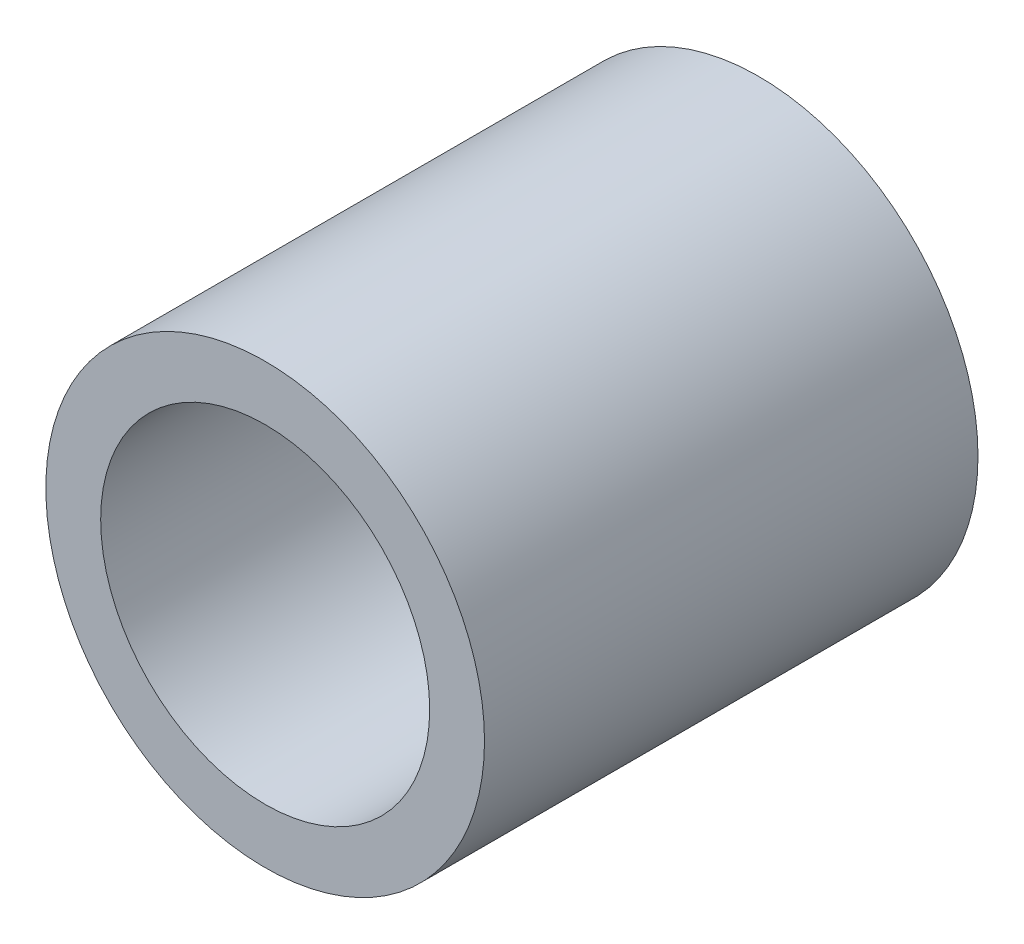
ISO-10303-21;
HEADER;
FILE_DESCRIPTION(('STEP AP214'),'2;1');
FILE_NAME('part.step','',(''),(''),'','','');
FILE_SCHEMA(('AUTOMOTIVE_DESIGN { 1 0 10303 214 1 1 1 1 }'));
ENDSEC;
DATA;
#1=APPLICATION_CONTEXT('core data for automotive mechanical design processes');
#2=APPLICATION_PROTOCOL_DEFINITION('international standard','automotive_design',2000,#1);
#3=PRODUCT_CONTEXT('',#1,'mechanical');
#4=PRODUCT('Part','Part','',(#3));
#5=PRODUCT_RELATED_PRODUCT_CATEGORY('part','',(#4));
#6=PRODUCT_DEFINITION_FORMATION('','',#4);
#7=PRODUCT_DEFINITION_CONTEXT('part definition',#1,'design');
#8=PRODUCT_DEFINITION('design','',#6,#7);
#9=PRODUCT_DEFINITION_SHAPE('','',#8);
#10=(LENGTH_UNIT() NAMED_UNIT(*) SI_UNIT(.MILLI.,.METRE.));
#11=(NAMED_UNIT(*) PLANE_ANGLE_UNIT() SI_UNIT($,.RADIAN.));
#12=(NAMED_UNIT(*) SI_UNIT($,.STERADIAN.) SOLID_ANGLE_UNIT());
#13=UNCERTAINTY_MEASURE_WITH_UNIT(LENGTH_MEASURE(1.E-05),#10,'distance_accuracy_value','');
#14=(GEOMETRIC_REPRESENTATION_CONTEXT(3) GLOBAL_UNCERTAINTY_ASSIGNED_CONTEXT((#13)) GLOBAL_UNIT_ASSIGNED_CONTEXT((#10,
#11,#12)) REPRESENTATION_CONTEXT('',''));
#15=CARTESIAN_POINT('',(0.,0.,0.));
#16=DIRECTION('',(0.,0.,1.));
#17=DIRECTION('',(1.,0.,0.));
#18=AXIS2_PLACEMENT_3D('',#15,#16,#17);
#19=CARTESIAN_POINT('',(0.,0.,64.4960244842766));
#20=DIRECTION('',(0.,0.,-1.));
#21=DIRECTION('',(-1.,0.,0.));
#22=AXIS2_PLACEMENT_3D('',#19,#20,#21);
#23=CYLINDRICAL_SURFACE('',#22,12.7);
#24=CARTESIAN_POINT('',(0.,0.,0.));
#25=DIRECTION('',(0.,0.,1.));
#26=DIRECTION('',(1.,0.,0.));
#27=AXIS2_PLACEMENT_3D('',#24,#25,#26);
#28=CIRCLE('',#27,12.7);
#29=CARTESIAN_POINT('',(12.7,0.,0.));
#30=VERTEX_POINT('',#29);
#31=EDGE_CURVE('E42',#30,#30,#28,.T.);
#32=ORIENTED_EDGE('',*,*,#31,.T.);
#33=EDGE_LOOP('',(#32));
#34=FACE_BOUND('',#33,.T.);
#35=CARTESIAN_POINT('',(0.,0.,28.575));
#36=DIRECTION('',(0.,0.,1.));
#37=DIRECTION('',(1.,0.,0.));
#38=AXIS2_PLACEMENT_3D('',#35,#36,#37);
#39=CIRCLE('',#38,12.7);
#40=CARTESIAN_POINT('',(12.7,0.,28.575));
#41=VERTEX_POINT('',#40);
#42=EDGE_CURVE('E10',#41,#41,#39,.T.);
#43=ORIENTED_EDGE('',*,*,#42,.F.);
#44=EDGE_LOOP('',(#43));
#45=FACE_BOUND('',#44,.T.);
#46=ADVANCED_FACE('F35',(#34,#45),#23,.T.);
#47=CARTESIAN_POINT('',(0.,0.,0.));
#48=DIRECTION('',(0.,0.,1.));
#49=DIRECTION('',(1.,0.,0.));
#50=AXIS2_PLACEMENT_3D('',#47,#48,#49);
#51=PLANE('',#50);
#52=CARTESIAN_POINT('',(0.,0.,0.));
#53=DIRECTION('',(0.,0.,1.));
#54=DIRECTION('',(1.,0.,0.));
#55=AXIS2_PLACEMENT_3D('',#52,#53,#54);
#56=CIRCLE('',#55,9.525);
#57=CARTESIAN_POINT('',(9.525,0.,0.));
#58=VERTEX_POINT('',#57);
#59=EDGE_CURVE('E46',#58,#58,#56,.T.);
#60=ORIENTED_EDGE('',*,*,#59,.T.);
#61=EDGE_LOOP('',(#60));
#62=FACE_BOUND('',#61,.T.);
#63=ORIENTED_EDGE('',*,*,#31,.F.);
#64=EDGE_LOOP('',(#63));
#65=FACE_BOUND('',#64,.T.);
#66=ADVANCED_FACE('F59',(#62,#65),#51,.F.);
#67=CARTESIAN_POINT('',(0.,0.,28.575));
#68=DIRECTION('',(0.,0.,1.));
#69=DIRECTION('',(1.,0.,0.));
#70=AXIS2_PLACEMENT_3D('',#67,#68,#69);
#71=PLANE('',#70);
#72=CARTESIAN_POINT('',(0.,0.,28.575));
#73=DIRECTION('',(0.,0.,1.));
#74=DIRECTION('',(1.,0.,0.));
#75=AXIS2_PLACEMENT_3D('',#72,#73,#74);
#76=CIRCLE('',#75,9.525);
#77=CARTESIAN_POINT('',(9.525,0.,28.575));
#78=VERTEX_POINT('',#77);
#79=EDGE_CURVE('E50',#78,#78,#76,.T.);
#80=ORIENTED_EDGE('',*,*,#79,.F.);
#81=EDGE_LOOP('',(#80));
#82=FACE_BOUND('',#81,.T.);
#83=ORIENTED_EDGE('',*,*,#42,.T.);
#84=EDGE_LOOP('',(#83));
#85=FACE_BOUND('',#84,.T.);
#86=ADVANCED_FACE('F37',(#82,#85),#71,.T.);
#87=CARTESIAN_POINT('',(0.,0.,0.));
#88=DIRECTION('',(0.,0.,1.));
#89=DIRECTION('',(1.,0.,0.));
#90=AXIS2_PLACEMENT_3D('',#87,#88,#89);
#91=CYLINDRICAL_SURFACE('',#90,9.525);
#92=ORIENTED_EDGE('',*,*,#59,.F.);
#93=EDGE_LOOP('',(#92));
#94=FACE_BOUND('',#93,.T.);
#95=ORIENTED_EDGE('',*,*,#79,.T.);
#96=EDGE_LOOP('',(#95));
#97=FACE_BOUND('',#96,.T.);
#98=ADVANCED_FACE('F56',(#94,#97),#91,.F.);
#99=CLOSED_SHELL('',(#46,#66,#86,#98));
#100=MANIFOLD_SOLID_BREP('B2',#99);
#101=ADVANCED_BREP_SHAPE_REPRESENTATION('',(#18,#100),#14);
#102=SHAPE_DEFINITION_REPRESENTATION(#9,#101);
ENDSEC;
END-ISO-10303-21;
